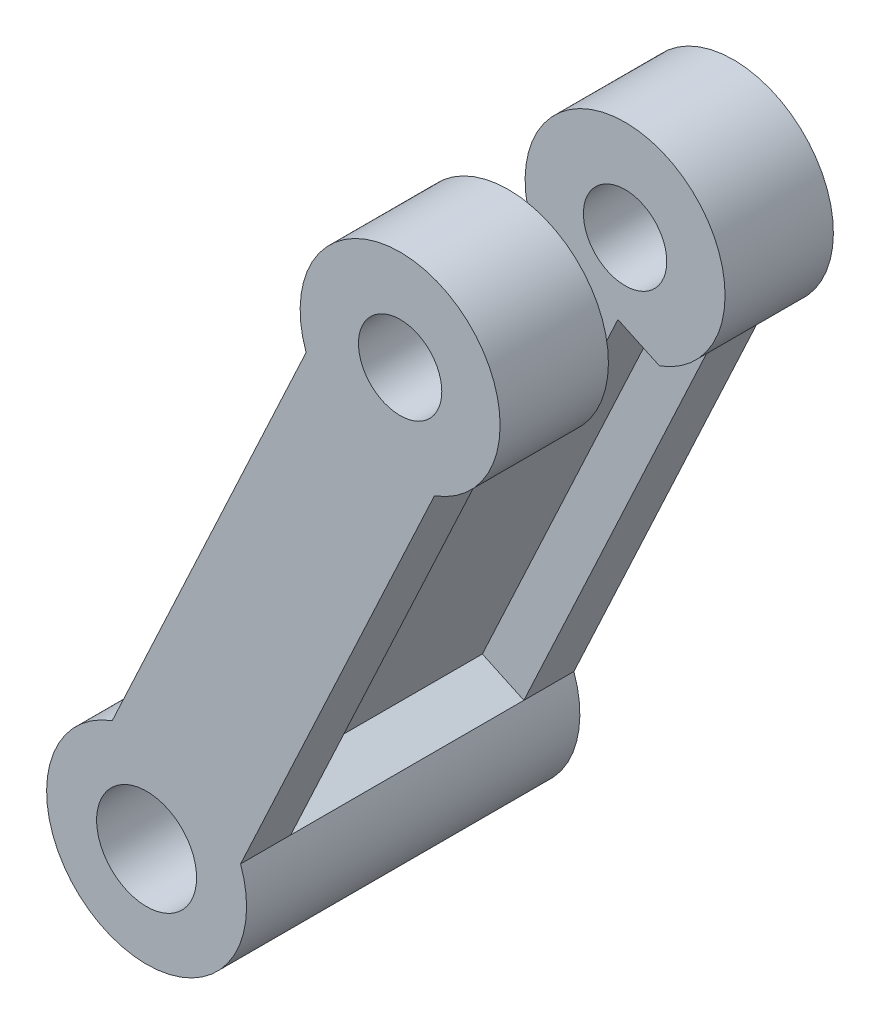
ISO-10303-21;
HEADER;
FILE_DESCRIPTION(('STEP AP214'),'2;1');
FILE_NAME('part.step','',(''),(''),'','','');
FILE_SCHEMA(('AUTOMOTIVE_DESIGN { 1 0 10303 214 1 1 1 1 }'));
ENDSEC;
DATA;
#1=APPLICATION_CONTEXT('core data for automotive mechanical design processes');
#2=APPLICATION_PROTOCOL_DEFINITION('international standard','automotive_design',2000,#1);
#3=PRODUCT_CONTEXT('',#1,'mechanical');
#4=PRODUCT('Part','Part','',(#3));
#5=PRODUCT_RELATED_PRODUCT_CATEGORY('part','',(#4));
#6=PRODUCT_DEFINITION_FORMATION('','',#4);
#7=PRODUCT_DEFINITION_CONTEXT('part definition',#1,'design');
#8=PRODUCT_DEFINITION('design','',#6,#7);
#9=PRODUCT_DEFINITION_SHAPE('','',#8);
#10=(LENGTH_UNIT() NAMED_UNIT(*) SI_UNIT(.MILLI.,.METRE.));
#11=(NAMED_UNIT(*) PLANE_ANGLE_UNIT() SI_UNIT($,.RADIAN.));
#12=(NAMED_UNIT(*) SI_UNIT($,.STERADIAN.) SOLID_ANGLE_UNIT());
#13=UNCERTAINTY_MEASURE_WITH_UNIT(LENGTH_MEASURE(1.E-05),#10,'distance_accuracy_value','');
#14=(GEOMETRIC_REPRESENTATION_CONTEXT(3) GLOBAL_UNCERTAINTY_ASSIGNED_CONTEXT((#13)) GLOBAL_UNIT_ASSIGNED_CONTEXT((#10,
#11,#12)) REPRESENTATION_CONTEXT('',''));
#15=CARTESIAN_POINT('',(0.,0.,0.));
#16=DIRECTION('',(0.,0.,1.));
#17=DIRECTION('',(1.,0.,0.));
#18=AXIS2_PLACEMENT_3D('',#15,#16,#17);
#19=CARTESIAN_POINT('',(65.5046891922218,130.41890257015,9.99999999999999));
#20=DIRECTION('',(0.906307787036651,-0.422618261740697,0.));
#21=DIRECTION('',(0.422618261740697,0.906307787036651,0.));
#22=AXIS2_PLACEMENT_3D('',#19,#20,#21);
#23=PLANE('',#22);
#24=DIRECTION('',(0.,0.,-1.));
#25=VECTOR('',#24,1.);
#26=CARTESIAN_POINT('',(78.929044766845,159.207526003311,9.99999999999999));
#27=LINE('',#26,#25);
#28=CARTESIAN_POINT('',(78.929044766845,159.207526003311,-7.00000000000002));
#29=VERTEX_POINT('',#28);
#30=CARTESIAN_POINT('',(78.929044766845,159.207526003311,-10.));
#31=VERTEX_POINT('',#30);
#32=EDGE_CURVE('E341',#29,#31,#27,.T.);
#33=ORIENTED_EDGE('',*,*,#32,.F.);
#34=DIRECTION('',(-0.422618261740697,-0.906307787036651,0.));
#35=VECTOR('',#34,1.);
#36=CARTESIAN_POINT('',(67.2945910402637,134.257359470309,-7.00000000000002));
#37=LINE('',#36,#35);
#38=CARTESIAN_POINT('',(67.2945910402637,134.257359470309,-7.00000000000002));
#39=VERTEX_POINT('',#38);
#40=EDGE_CURVE('E196',#29,#39,#37,.T.);
#41=ORIENTED_EDGE('',*,*,#40,.T.);
#42=DIRECTION('',(0.,0.,-1.));
#43=VECTOR('',#42,1.);
#44=CARTESIAN_POINT('',(67.2945910402637,134.257359470309,9.99999999999999));
#45=LINE('',#44,#43);
#46=CARTESIAN_POINT('',(67.2945910402637,134.257359470309,-10.));
#47=VERTEX_POINT('',#46);
#48=EDGE_CURVE('E318',#39,#47,#45,.T.);
#49=ORIENTED_EDGE('',*,*,#48,.T.);
#50=DIRECTION('',(-0.422618261740697,-0.906307787036651,0.));
#51=VECTOR('',#50,1.);
#52=CARTESIAN_POINT('',(65.5046891922218,130.41890257015,-10.));
#53=LINE('',#52,#51);
#54=EDGE_CURVE('E303',#31,#47,#53,.T.);
#55=ORIENTED_EDGE('',*,*,#54,.F.);
#56=EDGE_LOOP('',(#33,#41,#49,#55));
#57=FACE_BOUND('',#56,.T.);
#58=ADVANCED_FACE('F46',(#57),#23,.T.);
#59=CARTESIAN_POINT('',(67.2945910402637,134.257359470309,9.99999999999999));
#60=VERTEX_POINT('',#59);
#61=CARTESIAN_POINT('',(67.2945910402637,134.257359470309,6.99999999999999));
#62=VERTEX_POINT('',#61);
#63=EDGE_CURVE('E333',#60,#62,#45,.T.);
#64=ORIENTED_EDGE('',*,*,#63,.T.);
#65=DIRECTION('',(0.422618261740697,0.906307787036651,0.));
#66=VECTOR('',#65,1.);
#67=CARTESIAN_POINT('',(78.929044766845,159.207526003311,6.99999999999999));
#68=LINE('',#67,#66);
#69=CARTESIAN_POINT('',(78.929044766845,159.207526003311,6.99999999999999));
#70=VERTEX_POINT('',#69);
#71=EDGE_CURVE('E209',#62,#70,#68,.T.);
#72=ORIENTED_EDGE('',*,*,#71,.T.);
#73=CARTESIAN_POINT('',(78.929044766845,159.207526003311,9.99999999999999));
#74=VERTEX_POINT('',#73);
#75=EDGE_CURVE('E343',#74,#70,#27,.T.);
#76=ORIENTED_EDGE('',*,*,#75,.F.);
#77=DIRECTION('',(-0.422618261740697,-0.906307787036651,0.));
#78=VECTOR('',#77,1.);
#79=CARTESIAN_POINT('',(65.5046891922218,130.41890257015,9.99999999999999));
#80=LINE('',#79,#78);
#81=EDGE_CURVE('E309',#74,#60,#80,.T.);
#82=ORIENTED_EDGE('',*,*,#81,.T.);
#83=EDGE_LOOP('',(#64,#72,#76,#82));
#84=FACE_BOUND('',#83,.T.);
#85=ADVANCED_FACE('F407',(#84),#23,.T.);
#86=CARTESIAN_POINT('',(76.8671385199811,164.842110515867,-3.50000000000002));
#87=DIRECTION('',(0.,0.,1.));
#88=DIRECTION('',(1.,0.,0.));
#89=AXIS2_PLACEMENT_3D('',#86,#87,#88);
#90=PLANE('',#89);
#91=CARTESIAN_POINT('',(76.8671385199811,164.842110515867,-3.50000000000002));
#92=DIRECTION('',(0.,0.,1.));
#93=DIRECTION('',(1.,0.,0.));
#94=AXIS2_PLACEMENT_3D('',#91,#92,#93);
#95=CIRCLE('',#94,2.5);
#96=CARTESIAN_POINT('',(79.3671385199811,164.842110515867,-3.50000000000002));
#97=VERTEX_POINT('',#96);
#98=EDGE_CURVE('E310',#97,#97,#95,.F.);
#99=ORIENTED_EDGE('',*,*,#98,.T.);
#100=EDGE_LOOP('',(#99));
#101=FACE_BOUND('',#100,.T.);
#102=DIRECTION('',(-0.422618261740697,-0.906307787036651,0.));
#103=VECTOR('',#102,1.);
#104=CARTESIAN_POINT('',(78.2266002005361,164.208183123256,-3.50000000000002));
#105=LINE('',#104,#103);
#106=CARTESIAN_POINT('',(76.4366983524942,160.369726223098,-3.50000000000002));
#107=VERTEX_POINT('',#106);
#108=CARTESIAN_POINT('',(74.5349161746611,156.291341181433,-3.50000000000002));
#109=VERTEX_POINT('',#108);
#110=EDGE_CURVE('E58',#107,#109,#105,.T.);
#111=ORIENTED_EDGE('',*,*,#110,.F.);
#112=DIRECTION('',(0.906307787036651,-0.422618261740697,0.));
#113=VECTOR('',#112,1.);
#114=CARTESIAN_POINT('',(75.0772366719392,161.003653615709,-3.50000000000002));
#115=LINE('',#114,#113);
#116=CARTESIAN_POINT('',(78.929044766845,159.207526003311,-3.50000000000002));
#117=VERTEX_POINT('',#116);
#118=EDGE_CURVE('E189',#107,#117,#115,.T.);
#119=ORIENTED_EDGE('',*,*,#118,.T.);
#120=CARTESIAN_POINT('',(76.8671385199811,164.842110515867,-3.50000000000002));
#121=DIRECTION('',(0.,0.,1.));
#122=DIRECTION('',(1.,0.,0.));
#123=AXIS2_PLACEMENT_3D('',#120,#121,#122);
#124=CIRCLE('',#123,6.);
#125=CARTESIAN_POINT('',(71.2254285770335,162.799781228107,-3.50000000000002));
#126=VERTEX_POINT('',#125);
#127=EDGE_CURVE('E287',#117,#126,#124,.T.);
#128=ORIENTED_EDGE('',*,*,#127,.T.);
#129=DIRECTION('',(-0.906307787036651,0.422618261740697,0.));
#130=VECTOR('',#129,1.);
#131=CARTESIAN_POINT('',(75.0772366719392,161.003653615709,-3.50000000000002));
#132=LINE('',#131,#130);
#133=CARTESIAN_POINT('',(73.7177749913843,161.63758100832,-3.50000000000002));
#134=VERTEX_POINT('',#133);
#135=EDGE_CURVE('E277',#134,#126,#132,.T.);
#136=ORIENTED_EDGE('',*,*,#135,.F.);
#137=DIRECTION('',(0.422618261740697,0.906307787036651,0.));
#138=VECTOR('',#137,1.);
#139=CARTESIAN_POINT('',(75.5076768394262,165.476037908479,-3.50000000000002));
#140=LINE('',#139,#138);
#141=CARTESIAN_POINT('',(71.8159928135511,157.559195966655,-3.50000000000002));
#142=VERTEX_POINT('',#141);
#143=EDGE_CURVE('E280',#142,#134,#140,.T.);
#144=ORIENTED_EDGE('',*,*,#143,.F.);
#145=DIRECTION('',(-0.906307787036651,0.422618261740697,0.));
#146=VECTOR('',#145,1.);
#147=CARTESIAN_POINT('',(92.8988474447905,147.728099396339,-3.50000000000002));
#148=LINE('',#147,#146);
#149=EDGE_CURVE('E284',#109,#142,#148,.T.);
#150=ORIENTED_EDGE('',*,*,#149,.F.);
#151=EDGE_LOOP('',(#111,#119,#128,#136,#144,#150));
#152=FACE_BOUND('',#151,.T.);
#153=ADVANCED_FACE('F361',(#101,#152),#90,.T.);
#154=CARTESIAN_POINT('',(76.8671385199811,164.842110515867,3.49999999999999));
#155=DIRECTION('',(0.,0.,1.));
#156=DIRECTION('',(1.,0.,0.));
#157=AXIS2_PLACEMENT_3D('',#154,#155,#156);
#158=PLANE('',#157);
#159=CARTESIAN_POINT('',(76.8671385199811,164.842110515867,3.49999999999999));
#160=DIRECTION('',(0.,0.,1.));
#161=DIRECTION('',(1.,0.,0.));
#162=AXIS2_PLACEMENT_3D('',#159,#160,#161);
#163=CIRCLE('',#162,2.5);
#164=CARTESIAN_POINT('',(79.3671385199811,164.842110515867,3.49999999999999));
#165=VERTEX_POINT('',#164);
#166=EDGE_CURVE('E291',#165,#165,#163,.F.);
#167=ORIENTED_EDGE('',*,*,#166,.F.);
#168=EDGE_LOOP('',(#167));
#169=FACE_BOUND('',#168,.T.);
#170=DIRECTION('',(0.906307787036651,-0.422618261740697,0.));
#171=VECTOR('',#170,1.);
#172=CARTESIAN_POINT('',(75.0772366719392,161.003653615709,3.49999999999999));
#173=LINE('',#172,#171);
#174=CARTESIAN_POINT('',(76.4366983524942,160.369726223098,3.49999999999999));
#175=VERTEX_POINT('',#174);
#176=CARTESIAN_POINT('',(78.929044766845,159.207526003311,3.49999999999999));
#177=VERTEX_POINT('',#176);
#178=EDGE_CURVE('E12',#175,#177,#173,.T.);
#179=ORIENTED_EDGE('',*,*,#178,.F.);
#180=DIRECTION('',(-0.422618261740697,-0.906307787036651,0.));
#181=VECTOR('',#180,1.);
#182=CARTESIAN_POINT('',(78.2266002005361,164.208183123256,3.49999999999999));
#183=LINE('',#182,#181);
#184=CARTESIAN_POINT('',(74.5349161746611,156.291341181433,3.49999999999999));
#185=VERTEX_POINT('',#184);
#186=EDGE_CURVE('E235',#175,#185,#183,.T.);
#187=ORIENTED_EDGE('',*,*,#186,.T.);
#188=DIRECTION('',(-0.906307787036651,0.422618261740697,0.));
#189=VECTOR('',#188,1.);
#190=CARTESIAN_POINT('',(92.8988474447905,147.728099396339,3.49999999999999));
#191=LINE('',#190,#189);
#192=CARTESIAN_POINT('',(71.8159928135511,157.559195966655,3.49999999999999));
#193=VERTEX_POINT('',#192);
#194=EDGE_CURVE('E285',#185,#193,#191,.T.);
#195=ORIENTED_EDGE('',*,*,#194,.T.);
#196=DIRECTION('',(0.422618261740697,0.906307787036651,0.));
#197=VECTOR('',#196,1.);
#198=CARTESIAN_POINT('',(75.5076768394262,165.476037908479,3.49999999999999));
#199=LINE('',#198,#197);
#200=CARTESIAN_POINT('',(73.7177749913843,161.63758100832,3.49999999999999));
#201=VERTEX_POINT('',#200);
#202=EDGE_CURVE('E273',#193,#201,#199,.T.);
#203=ORIENTED_EDGE('',*,*,#202,.T.);
#204=DIRECTION('',(-0.906307787036651,0.422618261740697,0.));
#205=VECTOR('',#204,1.);
#206=CARTESIAN_POINT('',(75.0772366719392,161.003653615709,3.49999999999999));
#207=LINE('',#206,#205);
#208=CARTESIAN_POINT('',(71.2254285770335,162.799781228107,3.49999999999999));
#209=VERTEX_POINT('',#208);
#210=EDGE_CURVE('E352',#201,#209,#207,.T.);
#211=ORIENTED_EDGE('',*,*,#210,.T.);
#212=CARTESIAN_POINT('',(76.8671385199811,164.842110515867,3.49999999999999));
#213=DIRECTION('',(0.,0.,1.));
#214=DIRECTION('',(1.,0.,0.));
#215=AXIS2_PLACEMENT_3D('',#212,#213,#214);
#216=CIRCLE('',#215,6.);
#217=EDGE_CURVE('E283',#177,#209,#216,.T.);
#218=ORIENTED_EDGE('',*,*,#217,.F.);
#219=EDGE_LOOP('',(#179,#187,#195,#203,#211,#218));
#220=FACE_BOUND('',#219,.T.);
#221=ADVANCED_FACE('F394',(#169,#220),#158,.F.);
#222=CARTESIAN_POINT('',(57.8010730024103,134.011157794946,9.99999999999999));
#223=DIRECTION('',(0.906307787036651,-0.422618261740697,0.));
#224=DIRECTION('',(0.422618261740697,0.906307787036651,0.));
#225=AXIS2_PLACEMENT_3D('',#222,#223,#224);
#226=PLANE('',#225);
#227=DIRECTION('',(0.,0.,-1.));
#228=VECTOR('',#227,1.);
#229=CARTESIAN_POINT('',(59.5909748504522,137.849614695105,9.99999999999999));
#230=LINE('',#229,#228);
#231=CARTESIAN_POINT('',(59.5909748504522,137.849614695105,-7.00000000000002));
#232=VERTEX_POINT('',#231);
#233=CARTESIAN_POINT('',(59.5909748504522,137.849614695105,-10.));
#234=VERTEX_POINT('',#233);
#235=EDGE_CURVE('E334',#232,#234,#230,.T.);
#236=ORIENTED_EDGE('',*,*,#235,.F.);
#237=DIRECTION('',(-0.422618261740697,-0.906307787036651,0.));
#238=VECTOR('',#237,1.);
#239=CARTESIAN_POINT('',(59.5909748504522,137.849614695105,-7.00000000000002));
#240=LINE('',#239,#238);
#241=CARTESIAN_POINT('',(71.2254285770335,162.799781228107,-7.00000000000002));
#242=VERTEX_POINT('',#241);
#243=EDGE_CURVE('E240',#242,#232,#240,.T.);
#244=ORIENTED_EDGE('',*,*,#243,.F.);
#245=DIRECTION('',(0.,0.,-1.));
#246=VECTOR('',#245,1.);
#247=CARTESIAN_POINT('',(71.2254285770335,162.799781228107,9.99999999999999));
#248=LINE('',#247,#246);
#249=CARTESIAN_POINT('',(71.2254285770335,162.799781228107,-10.));
#250=VERTEX_POINT('',#249);
#251=EDGE_CURVE('E336',#242,#250,#248,.T.);
#252=ORIENTED_EDGE('',*,*,#251,.T.);
#253=DIRECTION('',(-0.422618261740697,-0.906307787036651,0.));
#254=VECTOR('',#253,1.);
#255=CARTESIAN_POINT('',(57.8010730024103,134.011157794946,-10.));
#256=LINE('',#255,#254);
#257=EDGE_CURVE('E327',#250,#234,#256,.T.);
#258=ORIENTED_EDGE('',*,*,#257,.T.);
#259=EDGE_LOOP('',(#236,#244,#252,#258));
#260=FACE_BOUND('',#259,.T.);
#261=ADVANCED_FACE('F431',(#260),#226,.F.);
#262=CARTESIAN_POINT('',(76.8671385199811,164.842110515867,9.99999999999999));
#263=DIRECTION('',(0.,0.,-1.));
#264=DIRECTION('',(-1.,0.,0.));
#265=AXIS2_PLACEMENT_3D('',#262,#263,#264);
#266=CYLINDRICAL_SURFACE('',#265,6.);
#267=ORIENTED_EDGE('',*,*,#127,.F.);
#268=EDGE_CURVE('E350',#117,#29,#27,.T.);
#269=ORIENTED_EDGE('',*,*,#268,.T.);
#270=ORIENTED_EDGE('',*,*,#32,.T.);
#271=CARTESIAN_POINT('',(76.8671385199811,164.842110515867,-10.));
#272=DIRECTION('',(0.,0.,1.));
#273=DIRECTION('',(1.,0.,0.));
#274=AXIS2_PLACEMENT_3D('',#271,#272,#273);
#275=CIRCLE('',#274,6.);
#276=EDGE_CURVE('E325',#31,#250,#275,.T.);
#277=ORIENTED_EDGE('',*,*,#276,.T.);
#278=ORIENTED_EDGE('',*,*,#251,.F.);
#279=EDGE_CURVE('E345',#126,#242,#248,.T.);
#280=ORIENTED_EDGE('',*,*,#279,.F.);
#281=EDGE_LOOP('',(#267,#269,#270,#277,#278,#280));
#282=FACE_BOUND('',#281,.T.);
#283=ADVANCED_FACE('F430',(#282),#266,.T.);
#284=CARTESIAN_POINT('',(76.8671385199811,164.842110515867,-10.));
#285=DIRECTION('',(0.,0.,1.));
#286=DIRECTION('',(1.,0.,0.));
#287=AXIS2_PLACEMENT_3D('',#284,#285,#286);
#288=CYLINDRICAL_SURFACE('',#287,2.5);
#289=CARTESIAN_POINT('',(76.8671385199811,164.842110515867,-10.));
#290=DIRECTION('',(0.,0.,1.));
#291=DIRECTION('',(1.,0.,0.));
#292=AXIS2_PLACEMENT_3D('',#289,#290,#291);
#293=CIRCLE('',#292,2.5);
#294=CARTESIAN_POINT('',(79.3671385199811,164.842110515867,-10.));
#295=VERTEX_POINT('',#294);
#296=EDGE_CURVE('E302',#295,#295,#293,.T.);
#297=ORIENTED_EDGE('',*,*,#296,.F.);
#298=EDGE_LOOP('',(#297));
#299=FACE_BOUND('',#298,.T.);
#300=ORIENTED_EDGE('',*,*,#98,.F.);
#301=EDGE_LOOP('',(#300));
#302=FACE_BOUND('',#301,.T.);
#303=ADVANCED_FACE('F476',(#299,#302),#288,.F.);
#304=ORIENTED_EDGE('',*,*,#75,.T.);
#305=DIRECTION('',(0.,0.,-1.));
#306=VECTOR('',#305,1.);
#307=CARTESIAN_POINT('',(78.929044766845,159.207526003311,-7.00000000000002));
#308=LINE('',#307,#306);
#309=EDGE_CURVE('E219',#70,#177,#308,.T.);
#310=ORIENTED_EDGE('',*,*,#309,.T.);
#311=ORIENTED_EDGE('',*,*,#217,.T.);
#312=DIRECTION('',(0.,0.,-1.));
#313=VECTOR('',#312,1.);
#314=CARTESIAN_POINT('',(71.2254285770335,162.799781228107,-7.00000000000002));
#315=LINE('',#314,#313);
#316=CARTESIAN_POINT('',(71.2254285770335,162.799781228107,6.99999999999999));
#317=VERTEX_POINT('',#316);
#318=EDGE_CURVE('E245',#317,#209,#315,.T.);
#319=ORIENTED_EDGE('',*,*,#318,.F.);
#320=CARTESIAN_POINT('',(71.2254285770335,162.799781228107,9.99999999999999));
#321=VERTEX_POINT('',#320);
#322=EDGE_CURVE('E339',#321,#317,#248,.T.);
#323=ORIENTED_EDGE('',*,*,#322,.F.);
#324=CARTESIAN_POINT('',(76.8671385199811,164.842110515867,9.99999999999999));
#325=DIRECTION('',(0.,0.,1.));
#326=DIRECTION('',(1.,0.,0.));
#327=AXIS2_PLACEMENT_3D('',#324,#325,#326);
#328=CIRCLE('',#327,6.);
#329=EDGE_CURVE('E312',#74,#321,#328,.T.);
#330=ORIENTED_EDGE('',*,*,#329,.F.);
#331=EDGE_LOOP('',(#304,#310,#311,#319,#323,#330));
#332=FACE_BOUND('',#331,.T.);
#333=ADVANCED_FACE('F403',(#332),#266,.T.);
#334=ORIENTED_EDGE('',*,*,#322,.T.);
#335=DIRECTION('',(0.422618261740697,0.906307787036651,0.));
#336=VECTOR('',#335,1.);
#337=CARTESIAN_POINT('',(71.2254285770335,162.799781228107,6.99999999999999));
#338=LINE('',#337,#336);
#339=CARTESIAN_POINT('',(59.5909748504522,137.849614695105,6.99999999999999));
#340=VERTEX_POINT('',#339);
#341=EDGE_CURVE('E260',#340,#317,#338,.T.);
#342=ORIENTED_EDGE('',*,*,#341,.F.);
#343=CARTESIAN_POINT('',(59.5909748504522,137.849614695105,9.99999999999999));
#344=VERTEX_POINT('',#343);
#345=EDGE_CURVE('E332',#344,#340,#230,.T.);
#346=ORIENTED_EDGE('',*,*,#345,.F.);
#347=DIRECTION('',(-0.422618261740697,-0.906307787036651,0.));
#348=VECTOR('',#347,1.);
#349=CARTESIAN_POINT('',(57.8010730024103,134.011157794946,9.99999999999999));
#350=LINE('',#349,#348);
#351=EDGE_CURVE('E317',#321,#344,#350,.T.);
#352=ORIENTED_EDGE('',*,*,#351,.F.);
#353=EDGE_LOOP('',(#334,#342,#346,#352));
#354=FACE_BOUND('',#353,.T.);
#355=ADVANCED_FACE('F437',(#354),#226,.F.);
#356=CARTESIAN_POINT('',(61.652881097316,132.215030182548,9.99999999999999));
#357=DIRECTION('',(0.,0.,-1.));
#358=DIRECTION('',(-1.,0.,0.));
#359=AXIS2_PLACEMENT_3D('',#356,#357,#358);
#360=CYLINDRICAL_SURFACE('',#359,6.);
#361=CARTESIAN_POINT('',(61.652881097316,132.215030182548,-10.));
#362=DIRECTION('',(0.,0.,1.));
#363=DIRECTION('',(1.,0.,0.));
#364=AXIS2_PLACEMENT_3D('',#361,#362,#363);
#365=CIRCLE('',#364,6.);
#366=EDGE_CURVE('E313',#234,#47,#365,.T.);
#367=ORIENTED_EDGE('',*,*,#366,.T.);
#368=ORIENTED_EDGE('',*,*,#48,.F.);
#369=DIRECTION('',(0.,0.,1.));
#370=VECTOR('',#369,1.);
#371=CARTESIAN_POINT('',(67.2945910402637,134.257359470309,6.99999999999999));
#372=LINE('',#371,#370);
#373=EDGE_CURVE('E207',#39,#62,#372,.T.);
#374=ORIENTED_EDGE('',*,*,#373,.T.);
#375=ORIENTED_EDGE('',*,*,#63,.F.);
#376=CARTESIAN_POINT('',(61.652881097316,132.215030182548,9.99999999999999));
#377=DIRECTION('',(0.,0.,1.));
#378=DIRECTION('',(1.,0.,0.));
#379=AXIS2_PLACEMENT_3D('',#376,#377,#378);
#380=CIRCLE('',#379,6.);
#381=EDGE_CURVE('E319',#344,#60,#380,.T.);
#382=ORIENTED_EDGE('',*,*,#381,.F.);
#383=ORIENTED_EDGE('',*,*,#345,.T.);
#384=DIRECTION('',(0.,0.,1.));
#385=VECTOR('',#384,1.);
#386=CARTESIAN_POINT('',(59.5909748504522,137.849614695105,6.99999999999999));
#387=LINE('',#386,#385);
#388=EDGE_CURVE('E253',#232,#340,#387,.T.);
#389=ORIENTED_EDGE('',*,*,#388,.F.);
#390=ORIENTED_EDGE('',*,*,#235,.T.);
#391=EDGE_LOOP('',(#367,#368,#374,#375,#382,#383,#389,#390));
#392=FACE_BOUND('',#391,.T.);
#393=ADVANCED_FACE('F420',(#392),#360,.T.);
#394=CARTESIAN_POINT('',(61.652881097316,132.215030182548,9.99999999999999));
#395=DIRECTION('',(0.,0.,1.));
#396=DIRECTION('',(1.,0.,0.));
#397=AXIS2_PLACEMENT_3D('',#394,#395,#396);
#398=PLANE('',#397);
#399=CARTESIAN_POINT('',(61.652881097316,132.215030182548,9.99999999999999));
#400=DIRECTION('',(0.,0.,1.));
#401=DIRECTION('',(1.,0.,0.));
#402=AXIS2_PLACEMENT_3D('',#399,#400,#401);
#403=CIRCLE('',#402,3.);
#404=CARTESIAN_POINT('',(64.652881097316,132.215030182548,9.99999999999999));
#405=VERTEX_POINT('',#404);
#406=EDGE_CURVE('E298',#405,#405,#403,.T.);
#407=ORIENTED_EDGE('',*,*,#406,.F.);
#408=EDGE_LOOP('',(#407));
#409=FACE_BOUND('',#408,.T.);
#410=CARTESIAN_POINT('',(76.8671385199811,164.842110515867,9.99999999999999));
#411=DIRECTION('',(0.,0.,1.));
#412=DIRECTION('',(1.,0.,0.));
#413=AXIS2_PLACEMENT_3D('',#410,#411,#412);
#414=CIRCLE('',#413,2.5);
#415=CARTESIAN_POINT('',(79.3671385199811,164.842110515867,9.99999999999999));
#416=VERTEX_POINT('',#415);
#417=EDGE_CURVE('E297',#416,#416,#414,.T.);
#418=ORIENTED_EDGE('',*,*,#417,.F.);
#419=EDGE_LOOP('',(#418));
#420=FACE_BOUND('',#419,.T.);
#421=ORIENTED_EDGE('',*,*,#81,.F.);
#422=ORIENTED_EDGE('',*,*,#329,.T.);
#423=ORIENTED_EDGE('',*,*,#351,.T.);
#424=ORIENTED_EDGE('',*,*,#381,.T.);
#425=EDGE_LOOP('',(#421,#422,#423,#424));
#426=FACE_BOUND('',#425,.T.);
#427=ADVANCED_FACE('F445',(#409,#420,#426),#398,.T.);
#428=CARTESIAN_POINT('',(61.652881097316,132.215030182548,-10.));
#429=DIRECTION('',(0.,0.,1.));
#430=DIRECTION('',(1.,0.,0.));
#431=AXIS2_PLACEMENT_3D('',#428,#429,#430);
#432=PLANE('',#431);
#433=CARTESIAN_POINT('',(61.652881097316,132.215030182548,-10.));
#434=DIRECTION('',(0.,0.,1.));
#435=DIRECTION('',(1.,0.,0.));
#436=AXIS2_PLACEMENT_3D('',#433,#434,#435);
#437=CIRCLE('',#436,3.);
#438=CARTESIAN_POINT('',(64.652881097316,132.215030182548,-10.));
#439=VERTEX_POINT('',#438);
#440=EDGE_CURVE('E299',#439,#439,#437,.T.);
#441=ORIENTED_EDGE('',*,*,#440,.T.);
#442=EDGE_LOOP('',(#441));
#443=FACE_BOUND('',#442,.T.);
#444=ORIENTED_EDGE('',*,*,#296,.T.);
#445=EDGE_LOOP('',(#444));
#446=FACE_BOUND('',#445,.T.);
#447=ORIENTED_EDGE('',*,*,#54,.T.);
#448=ORIENTED_EDGE('',*,*,#366,.F.);
#449=ORIENTED_EDGE('',*,*,#257,.F.);
#450=ORIENTED_EDGE('',*,*,#276,.F.);
#451=EDGE_LOOP('',(#447,#448,#449,#450));
#452=FACE_BOUND('',#451,.T.);
#453=ADVANCED_FACE('F434',(#443,#446,#452),#432,.F.);
#454=ORIENTED_EDGE('',*,*,#166,.T.);
#455=EDGE_LOOP('',(#454));
#456=FACE_BOUND('',#455,.T.);
#457=ORIENTED_EDGE('',*,*,#417,.T.);
#458=EDGE_LOOP('',(#457));
#459=FACE_BOUND('',#458,.T.);
#460=ADVANCED_FACE('F448',(#456,#459),#288,.F.);
#461=CARTESIAN_POINT('',(61.652881097316,132.215030182548,-10.));
#462=DIRECTION('',(0.,0.,1.));
#463=DIRECTION('',(1.,0.,0.));
#464=AXIS2_PLACEMENT_3D('',#461,#462,#463);
#465=CYLINDRICAL_SURFACE('',#464,3.);
#466=ORIENTED_EDGE('',*,*,#440,.F.);
#467=EDGE_LOOP('',(#466));
#468=FACE_BOUND('',#467,.T.);
#469=ORIENTED_EDGE('',*,*,#406,.T.);
#470=EDGE_LOOP('',(#469));
#471=FACE_BOUND('',#470,.T.);
#472=ADVANCED_FACE('F473',(#468,#471),#465,.F.);
#473=CARTESIAN_POINT('',(92.8988474447905,147.728099396339,2.49999999999999));
#474=DIRECTION('',(-0.906307787036651,0.422618261740697,0.));
#475=DIRECTION('',(-0.422618261740697,-0.906307787036651,0.));
#476=AXIS2_PLACEMENT_3D('',#473,#474,#475);
#477=CYLINDRICAL_SURFACE('',#476,1.);
#478=ORIENTED_EDGE('',*,*,#194,.F.);
#479=CARTESIAN_POINT('',(74.5349161746611,156.291341181433,2.49999999999999));
#480=DIRECTION('',(-0.906307787036651,0.422618261740697,0.));
#481=DIRECTION('',(-0.422618261740697,-0.906307787036651,0.));
#482=AXIS2_PLACEMENT_3D('',#479,#480,#481);
#483=CIRCLE('',#482,1.);
#484=CARTESIAN_POINT('',(74.1122979129204,155.385033394396,2.49999999999998));
#485=VERTEX_POINT('',#484);
#486=EDGE_CURVE('E230',#185,#485,#483,.F.);
#487=ORIENTED_EDGE('',*,*,#486,.T.);
#488=DIRECTION('',(-0.906307787036651,0.422618261740697,0.));
#489=VECTOR('',#488,1.);
#490=CARTESIAN_POINT('',(92.4762291830498,146.821791609303,2.49999999999998));
#491=LINE('',#490,#489);
#492=CARTESIAN_POINT('',(71.3933745518104,156.652888179618,2.49999999999998));
#493=VERTEX_POINT('',#492);
#494=EDGE_CURVE('E288',#485,#493,#491,.T.);
#495=ORIENTED_EDGE('',*,*,#494,.T.);
#496=CARTESIAN_POINT('',(71.8159928135511,157.559195966655,2.49999999999999));
#497=DIRECTION('',(0.906307787036651,-0.422618261740697,0.));
#498=DIRECTION('',(0.422618261740697,0.906307787036651,0.));
#499=AXIS2_PLACEMENT_3D('',#496,#497,#498);
#500=CIRCLE('',#499,1.);
#501=EDGE_CURVE('E275',#493,#193,#500,.F.);
#502=ORIENTED_EDGE('',*,*,#501,.T.);
#503=EDGE_LOOP('',(#478,#487,#495,#502));
#504=FACE_BOUND('',#503,.T.);
#505=ADVANCED_FACE('F398',(#504),#477,.F.);
#506=CARTESIAN_POINT('',(92.4762291830498,146.821791609303,2.49999999999998));
#507=DIRECTION('',(-0.422618261740697,-0.906307787036651,0.));
#508=DIRECTION('',(0.906307787036651,-0.422618261740697,0.));
#509=AXIS2_PLACEMENT_3D('',#506,#507,#508);
#510=PLANE('',#509);
#511=ORIENTED_EDGE('',*,*,#494,.F.);
#512=DIRECTION('',(0.,0.,-1.));
#513=VECTOR('',#512,1.);
#514=CARTESIAN_POINT('',(74.1122979129204,155.385033394396,2.49999999999998));
#515=LINE('',#514,#513);
#516=CARTESIAN_POINT('',(74.1122979129204,155.385033394396,-2.50000000000002));
#517=VERTEX_POINT('',#516);
#518=EDGE_CURVE('E224',#485,#517,#515,.T.);
#519=ORIENTED_EDGE('',*,*,#518,.T.);
#520=DIRECTION('',(-0.906307787036651,0.422618261740697,0.));
#521=VECTOR('',#520,1.);
#522=CARTESIAN_POINT('',(92.4762291830498,146.821791609303,-2.50000000000002));
#523=LINE('',#522,#521);
#524=CARTESIAN_POINT('',(71.3933745518104,156.652888179618,-2.50000000000002));
#525=VERTEX_POINT('',#524);
#526=EDGE_CURVE('E70',#517,#525,#523,.T.);
#527=ORIENTED_EDGE('',*,*,#526,.T.);
#528=DIRECTION('',(0.,0.,1.));
#529=VECTOR('',#528,1.);
#530=CARTESIAN_POINT('',(71.3933745518104,156.652888179618,2.49999999999998));
#531=LINE('',#530,#529);
#532=EDGE_CURVE('E263',#525,#493,#531,.T.);
#533=ORIENTED_EDGE('',*,*,#532,.T.);
#534=EDGE_LOOP('',(#511,#519,#527,#533));
#535=FACE_BOUND('',#534,.T.);
#536=ADVANCED_FACE('F396',(#535),#510,.F.);
#537=CARTESIAN_POINT('',(92.8988474447905,147.728099396339,-2.50000000000002));
#538=DIRECTION('',(-0.906307787036651,0.422618261740697,0.));
#539=DIRECTION('',(-0.422618261740697,-0.906307787036651,0.));
#540=AXIS2_PLACEMENT_3D('',#537,#538,#539);
#541=CYLINDRICAL_SURFACE('',#540,1.);
#542=ORIENTED_EDGE('',*,*,#526,.F.);
#543=CARTESIAN_POINT('',(74.5349161746611,156.291341181433,-2.50000000000002));
#544=DIRECTION('',(-0.906307787036651,0.422618261740697,0.));
#545=DIRECTION('',(-0.422618261740697,-0.906307787036651,0.));
#546=AXIS2_PLACEMENT_3D('',#543,#544,#545);
#547=CIRCLE('',#546,1.);
#548=EDGE_CURVE('E52',#517,#109,#547,.F.);
#549=ORIENTED_EDGE('',*,*,#548,.T.);
#550=ORIENTED_EDGE('',*,*,#149,.T.);
#551=CARTESIAN_POINT('',(71.8159928135511,157.559195966655,-2.50000000000002));
#552=DIRECTION('',(0.906307787036651,-0.422618261740697,0.));
#553=DIRECTION('',(0.422618261740697,0.906307787036651,0.));
#554=AXIS2_PLACEMENT_3D('',#551,#552,#553);
#555=CIRCLE('',#554,1.);
#556=EDGE_CURVE('E349',#142,#525,#555,.F.);
#557=ORIENTED_EDGE('',*,*,#556,.T.);
#558=EDGE_LOOP('',(#542,#549,#550,#557));
#559=FACE_BOUND('',#558,.T.);
#560=ADVANCED_FACE('F360',(#559),#541,.F.);
#561=CARTESIAN_POINT('',(73.7177749913843,161.63758100832,-7.00000000000002));
#562=DIRECTION('',(0.422618261740697,0.906307787036651,0.));
#563=DIRECTION('',(-0.906307787036651,0.422618261740697,0.));
#564=AXIS2_PLACEMENT_3D('',#561,#562,#563);
#565=PLANE('',#564);
#566=DIRECTION('',(0.,0.,-1.));
#567=VECTOR('',#566,1.);
#568=CARTESIAN_POINT('',(73.7177749913843,161.63758100832,-7.00000000000002));
#569=LINE('',#568,#567);
#570=CARTESIAN_POINT('',(73.7177749913843,161.63758100832,6.99999999999999));
#571=VERTEX_POINT('',#570);
#572=EDGE_CURVE('E248',#571,#201,#569,.T.);
#573=ORIENTED_EDGE('',*,*,#572,.F.);
#574=DIRECTION('',(-0.906307787036651,0.422618261740697,0.));
#575=VECTOR('',#574,1.);
#576=CARTESIAN_POINT('',(73.7177749913843,161.63758100832,6.99999999999999));
#577=LINE('',#576,#575);
#578=EDGE_CURVE('E268',#571,#317,#577,.T.);
#579=ORIENTED_EDGE('',*,*,#578,.T.);
#580=ORIENTED_EDGE('',*,*,#318,.T.);
#581=ORIENTED_EDGE('',*,*,#210,.F.);
#582=EDGE_LOOP('',(#573,#579,#580,#581));
#583=FACE_BOUND('',#582,.T.);
#584=ADVANCED_FACE('F386',(#583),#565,.F.);
#585=CARTESIAN_POINT('',(62.083321264803,136.687414475318,-7.00000000000002));
#586=DIRECTION('',(0.,0.,-1.));
#587=DIRECTION('',(0.,1.,0.));
#588=AXIS2_PLACEMENT_3D('',#585,#586,#587);
#589=PLANE('',#588);
#590=ORIENTED_EDGE('',*,*,#243,.T.);
#591=DIRECTION('',(-0.906307787036651,0.422618261740697,0.));
#592=VECTOR('',#591,1.);
#593=CARTESIAN_POINT('',(62.083321264803,136.687414475318,-7.00000000000002));
#594=LINE('',#593,#592);
#595=CARTESIAN_POINT('',(62.083321264803,136.687414475318,-7.00000000000002));
#596=VERTEX_POINT('',#595);
#597=EDGE_CURVE('E255',#596,#232,#594,.T.);
#598=ORIENTED_EDGE('',*,*,#597,.F.);
#599=DIRECTION('',(-0.422618261740697,-0.906307787036651,0.));
#600=VECTOR('',#599,1.);
#601=CARTESIAN_POINT('',(62.083321264803,136.687414475318,-7.00000000000002));
#602=LINE('',#601,#600);
#603=CARTESIAN_POINT('',(73.7177749913843,161.63758100832,-7.00000000000002));
#604=VERTEX_POINT('',#603);
#605=EDGE_CURVE('E238',#604,#596,#602,.T.);
#606=ORIENTED_EDGE('',*,*,#605,.F.);
#607=DIRECTION('',(-0.906307787036651,0.422618261740697,0.));
#608=VECTOR('',#607,1.);
#609=CARTESIAN_POINT('',(73.7177749913843,161.63758100832,-7.00000000000002));
#610=LINE('',#609,#608);
#611=EDGE_CURVE('E264',#604,#242,#610,.T.);
#612=ORIENTED_EDGE('',*,*,#611,.T.);
#613=EDGE_LOOP('',(#590,#598,#606,#612));
#614=FACE_BOUND('',#613,.T.);
#615=ADVANCED_FACE('F374',(#614),#589,.F.);
#616=ORIENTED_EDGE('',*,*,#135,.T.);
#617=ORIENTED_EDGE('',*,*,#279,.T.);
#618=ORIENTED_EDGE('',*,*,#611,.F.);
#619=EDGE_CURVE('E247',#134,#604,#569,.T.);
#620=ORIENTED_EDGE('',*,*,#619,.F.);
#621=EDGE_LOOP('',(#616,#617,#618,#620));
#622=FACE_BOUND('',#621,.T.);
#623=ADVANCED_FACE('F369',(#622),#565,.F.);
#624=CARTESIAN_POINT('',(73.7177749913843,161.63758100832,6.99999999999999));
#625=DIRECTION('',(0.,0.,1.));
#626=DIRECTION('',(0.,-1.,0.));
#627=AXIS2_PLACEMENT_3D('',#624,#625,#626);
#628=PLANE('',#627);
#629=ORIENTED_EDGE('',*,*,#341,.T.);
#630=ORIENTED_EDGE('',*,*,#578,.F.);
#631=DIRECTION('',(0.422618261740697,0.906307787036651,0.));
#632=VECTOR('',#631,1.);
#633=CARTESIAN_POINT('',(73.7177749913843,161.63758100832,6.99999999999999));
#634=LINE('',#633,#632);
#635=CARTESIAN_POINT('',(62.083321264803,136.687414475318,6.99999999999999));
#636=VERTEX_POINT('',#635);
#637=EDGE_CURVE('E244',#636,#571,#634,.T.);
#638=ORIENTED_EDGE('',*,*,#637,.F.);
#639=DIRECTION('',(-0.906307787036651,0.422618261740697,0.));
#640=VECTOR('',#639,1.);
#641=CARTESIAN_POINT('',(62.083321264803,136.687414475318,6.99999999999999));
#642=LINE('',#641,#640);
#643=EDGE_CURVE('E266',#636,#340,#642,.T.);
#644=ORIENTED_EDGE('',*,*,#643,.T.);
#645=EDGE_LOOP('',(#629,#630,#638,#644));
#646=FACE_BOUND('',#645,.T.);
#647=ADVANCED_FACE('F381',(#646),#628,.F.);
#648=CARTESIAN_POINT('',(62.083321264803,136.687414475318,6.99999999999999));
#649=DIRECTION('',(-0.422618261740697,-0.906307787036651,0.));
#650=DIRECTION('',(0.906307787036651,-0.422618261740697,0.));
#651=AXIS2_PLACEMENT_3D('',#648,#649,#650);
#652=PLANE('',#651);
#653=ORIENTED_EDGE('',*,*,#388,.T.);
#654=ORIENTED_EDGE('',*,*,#643,.F.);
#655=DIRECTION('',(0.,0.,1.));
#656=VECTOR('',#655,1.);
#657=CARTESIAN_POINT('',(62.083321264803,136.687414475318,6.99999999999999));
#658=LINE('',#657,#656);
#659=EDGE_CURVE('E241',#596,#636,#658,.T.);
#660=ORIENTED_EDGE('',*,*,#659,.F.);
#661=ORIENTED_EDGE('',*,*,#597,.T.);
#662=EDGE_LOOP('',(#653,#654,#660,#661));
#663=FACE_BOUND('',#662,.T.);
#664=ADVANCED_FACE('F379',(#663),#652,.F.);
#665=CARTESIAN_POINT('',(60.2934194167611,132.848957575159,0.));
#666=DIRECTION('',(0.906307787036651,-0.422618261740697,0.));
#667=DIRECTION('',(0.422618261740697,0.906307787036651,0.));
#668=AXIS2_PLACEMENT_3D('',#665,#666,#667);
#669=PLANE('',#668);
#670=ORIENTED_EDGE('',*,*,#143,.T.);
#671=ORIENTED_EDGE('',*,*,#619,.T.);
#672=ORIENTED_EDGE('',*,*,#605,.T.);
#673=ORIENTED_EDGE('',*,*,#659,.T.);
#674=ORIENTED_EDGE('',*,*,#637,.T.);
#675=ORIENTED_EDGE('',*,*,#572,.T.);
#676=ORIENTED_EDGE('',*,*,#202,.F.);
#677=ORIENTED_EDGE('',*,*,#501,.F.);
#678=ORIENTED_EDGE('',*,*,#532,.F.);
#679=ORIENTED_EDGE('',*,*,#556,.F.);
#680=EDGE_LOOP('',(#670,#671,#672,#673,#674,#675,#676,#677,#678,#679));
#681=FACE_BOUND('',#680,.T.);
#682=ADVANCED_FACE('F370',(#681),#669,.F.);
#683=CARTESIAN_POINT('',(76.4366983524942,160.369726223098,-7.00000000000002));
#684=DIRECTION('',(-0.422618261740697,-0.906307787036651,0.));
#685=DIRECTION('',(0.906307787036651,-0.422618261740697,0.));
#686=AXIS2_PLACEMENT_3D('',#683,#684,#685);
#687=PLANE('',#686);
#688=ORIENTED_EDGE('',*,*,#178,.T.);
#689=ORIENTED_EDGE('',*,*,#309,.F.);
#690=DIRECTION('',(0.906307787036651,-0.422618261740697,0.));
#691=VECTOR('',#690,1.);
#692=CARTESIAN_POINT('',(76.4366983524942,160.369726223098,6.99999999999999));
#693=LINE('',#692,#691);
#694=CARTESIAN_POINT('',(76.4366983524942,160.369726223098,6.99999999999999));
#695=VERTEX_POINT('',#694);
#696=EDGE_CURVE('E203',#695,#70,#693,.T.);
#697=ORIENTED_EDGE('',*,*,#696,.F.);
#698=DIRECTION('',(0.,0.,-1.));
#699=VECTOR('',#698,1.);
#700=CARTESIAN_POINT('',(76.4366983524942,160.369726223098,-7.00000000000002));
#701=LINE('',#700,#699);
#702=EDGE_CURVE('E188',#695,#175,#701,.T.);
#703=ORIENTED_EDGE('',*,*,#702,.T.);
#704=EDGE_LOOP('',(#688,#689,#697,#703));
#705=FACE_BOUND('',#704,.T.);
#706=ADVANCED_FACE('F405',(#705),#687,.T.);
#707=CARTESIAN_POINT('',(64.8022446259129,135.419559690096,-7.00000000000002));
#708=DIRECTION('',(0.,0.,1.));
#709=DIRECTION('',(0.,-1.,0.));
#710=AXIS2_PLACEMENT_3D('',#707,#708,#709);
#711=PLANE('',#710);
#712=ORIENTED_EDGE('',*,*,#40,.F.);
#713=DIRECTION('',(0.906307787036651,-0.422618261740697,0.));
#714=VECTOR('',#713,1.);
#715=CARTESIAN_POINT('',(76.4366983524942,160.369726223098,-7.00000000000002));
#716=LINE('',#715,#714);
#717=CARTESIAN_POINT('',(76.4366983524942,160.369726223098,-7.00000000000002));
#718=VERTEX_POINT('',#717);
#719=EDGE_CURVE('E184',#718,#29,#716,.T.);
#720=ORIENTED_EDGE('',*,*,#719,.F.);
#721=DIRECTION('',(-0.422618261740697,-0.906307787036651,0.));
#722=VECTOR('',#721,1.);
#723=CARTESIAN_POINT('',(64.8022446259129,135.419559690096,-7.00000000000002));
#724=LINE('',#723,#722);
#725=CARTESIAN_POINT('',(64.8022446259129,135.419559690096,-7.00000000000002));
#726=VERTEX_POINT('',#725);
#727=EDGE_CURVE('E194',#718,#726,#724,.T.);
#728=ORIENTED_EDGE('',*,*,#727,.T.);
#729=DIRECTION('',(0.906307787036651,-0.422618261740697,0.));
#730=VECTOR('',#729,1.);
#731=CARTESIAN_POINT('',(64.8022446259129,135.419559690096,-7.00000000000002));
#732=LINE('',#731,#730);
#733=EDGE_CURVE('E225',#726,#39,#732,.T.);
#734=ORIENTED_EDGE('',*,*,#733,.T.);
#735=EDGE_LOOP('',(#712,#720,#728,#734));
#736=FACE_BOUND('',#735,.T.);
#737=ADVANCED_FACE('F192',(#736),#711,.T.);
#738=CARTESIAN_POINT('',(64.8022446259129,135.419559690096,6.99999999999999));
#739=DIRECTION('',(0.422618261740697,0.906307787036651,0.));
#740=DIRECTION('',(-0.906307787036651,0.422618261740697,0.));
#741=AXIS2_PLACEMENT_3D('',#738,#739,#740);
#742=PLANE('',#741);
#743=ORIENTED_EDGE('',*,*,#373,.F.);
#744=ORIENTED_EDGE('',*,*,#733,.F.);
#745=DIRECTION('',(0.,0.,1.));
#746=VECTOR('',#745,1.);
#747=CARTESIAN_POINT('',(64.8022446259129,135.419559690096,6.99999999999999));
#748=LINE('',#747,#746);
#749=CARTESIAN_POINT('',(64.8022446259129,135.419559690096,6.99999999999999));
#750=VERTEX_POINT('',#749);
#751=EDGE_CURVE('E205',#726,#750,#748,.T.);
#752=ORIENTED_EDGE('',*,*,#751,.T.);
#753=DIRECTION('',(0.906307787036651,-0.422618261740697,0.));
#754=VECTOR('',#753,1.);
#755=CARTESIAN_POINT('',(64.8022446259129,135.419559690096,6.99999999999999));
#756=LINE('',#755,#754);
#757=EDGE_CURVE('E222',#750,#62,#756,.T.);
#758=ORIENTED_EDGE('',*,*,#757,.T.);
#759=EDGE_LOOP('',(#743,#744,#752,#758));
#760=FACE_BOUND('',#759,.T.);
#761=ADVANCED_FACE('F417',(#760),#742,.T.);
#762=CARTESIAN_POINT('',(76.4366983524942,160.369726223098,6.99999999999999));
#763=DIRECTION('',(0.,0.,-1.));
#764=DIRECTION('',(0.,1.,0.));
#765=AXIS2_PLACEMENT_3D('',#762,#763,#764);
#766=PLANE('',#765);
#767=ORIENTED_EDGE('',*,*,#71,.F.);
#768=ORIENTED_EDGE('',*,*,#757,.F.);
#769=DIRECTION('',(0.422618261740697,0.906307787036651,0.));
#770=VECTOR('',#769,1.);
#771=CARTESIAN_POINT('',(76.4366983524942,160.369726223098,6.99999999999999));
#772=LINE('',#771,#770);
#773=EDGE_CURVE('E215',#750,#695,#772,.T.);
#774=ORIENTED_EDGE('',*,*,#773,.T.);
#775=ORIENTED_EDGE('',*,*,#696,.T.);
#776=EDGE_LOOP('',(#767,#768,#774,#775));
#777=FACE_BOUND('',#776,.T.);
#778=ADVANCED_FACE('F411',(#777),#766,.T.);
#779=EDGE_CURVE('E185',#107,#718,#701,.T.);
#780=ORIENTED_EDGE('',*,*,#779,.T.);
#781=ORIENTED_EDGE('',*,*,#719,.T.);
#782=ORIENTED_EDGE('',*,*,#268,.F.);
#783=ORIENTED_EDGE('',*,*,#118,.F.);
#784=EDGE_LOOP('',(#780,#781,#782,#783));
#785=FACE_BOUND('',#784,.T.);
#786=ADVANCED_FACE('F183',(#785),#687,.T.);
#787=CARTESIAN_POINT('',(63.012342777871,131.581102789937,0.));
#788=DIRECTION('',(-0.906307787036651,0.422618261740697,0.));
#789=DIRECTION('',(0.422618261740697,0.906307787036651,0.));
#790=AXIS2_PLACEMENT_3D('',#787,#788,#789);
#791=PLANE('',#790);
#792=ORIENTED_EDGE('',*,*,#110,.T.);
#793=ORIENTED_EDGE('',*,*,#548,.F.);
#794=ORIENTED_EDGE('',*,*,#518,.F.);
#795=ORIENTED_EDGE('',*,*,#486,.F.);
#796=ORIENTED_EDGE('',*,*,#186,.F.);
#797=ORIENTED_EDGE('',*,*,#702,.F.);
#798=ORIENTED_EDGE('',*,*,#773,.F.);
#799=ORIENTED_EDGE('',*,*,#751,.F.);
#800=ORIENTED_EDGE('',*,*,#727,.F.);
#801=ORIENTED_EDGE('',*,*,#779,.F.);
#802=EDGE_LOOP('',(#792,#793,#794,#795,#796,#797,#798,#799,#800,#801));
#803=FACE_BOUND('',#802,.T.);
#804=ADVANCED_FACE('F204',(#803),#791,.F.);
#805=CLOSED_SHELL('',(#58,#85,#153,#221,#261,#283,#303,#333,#355,#393,#427,#453,#460,#472,#505,
#536,#560,#584,#615,#623,#647,#664,#682,#706,#737,#761,#778,#786,#804));
#806=MANIFOLD_SOLID_BREP('B2',#805);
#807=ADVANCED_BREP_SHAPE_REPRESENTATION('',(#18,#806),#14);
#808=SHAPE_DEFINITION_REPRESENTATION(#9,#807);
ENDSEC;
END-ISO-10303-21;
